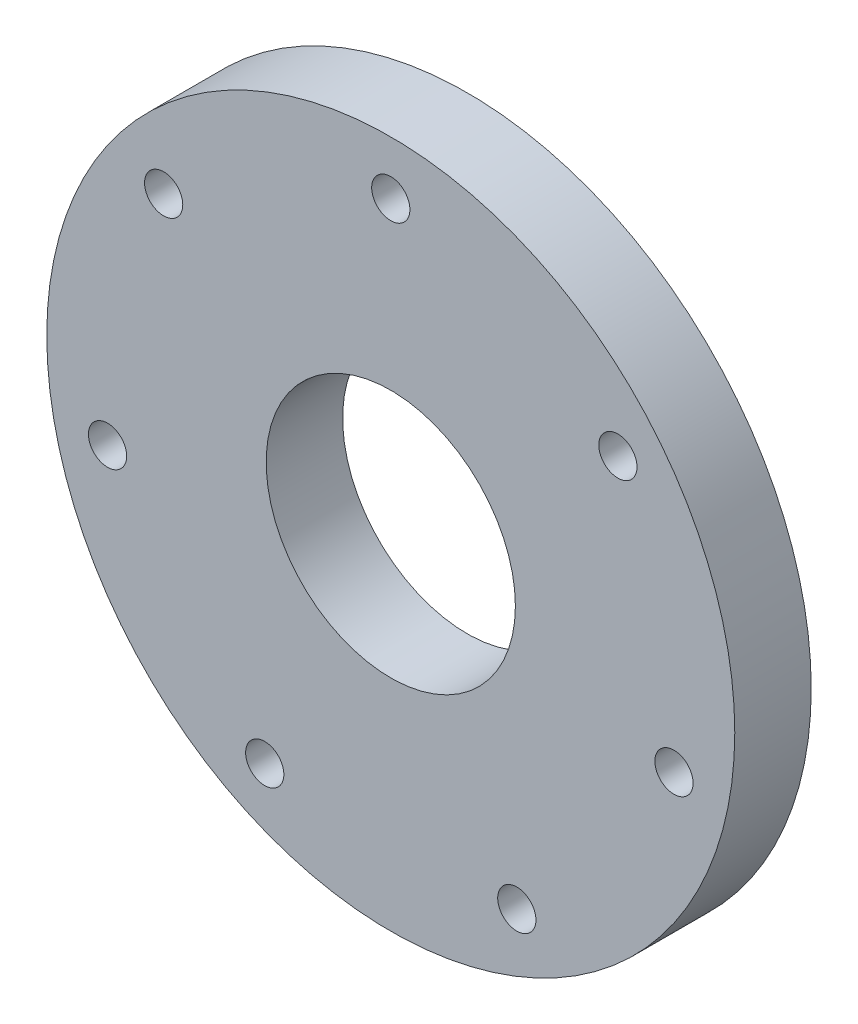
ISO-10303-21;
HEADER;
FILE_DESCRIPTION(('STEP AP214'),'2;1');
FILE_NAME('part.step','',(''),(''),'','','');
FILE_SCHEMA(('AUTOMOTIVE_DESIGN { 1 0 10303 214 1 1 1 1 }'));
ENDSEC;
DATA;
#1=APPLICATION_CONTEXT('core data for automotive mechanical design processes');
#2=APPLICATION_PROTOCOL_DEFINITION('international standard','automotive_design',2000,#1);
#3=PRODUCT_CONTEXT('',#1,'mechanical');
#4=PRODUCT('Part','Part','',(#3));
#5=PRODUCT_RELATED_PRODUCT_CATEGORY('part','',(#4));
#6=PRODUCT_DEFINITION_FORMATION('','',#4);
#7=PRODUCT_DEFINITION_CONTEXT('part definition',#1,'design');
#8=PRODUCT_DEFINITION('design','',#6,#7);
#9=PRODUCT_DEFINITION_SHAPE('','',#8);
#10=(LENGTH_UNIT() NAMED_UNIT(*) SI_UNIT(.MILLI.,.METRE.));
#11=(NAMED_UNIT(*) PLANE_ANGLE_UNIT() SI_UNIT($,.RADIAN.));
#12=(NAMED_UNIT(*) SI_UNIT($,.STERADIAN.) SOLID_ANGLE_UNIT());
#13=UNCERTAINTY_MEASURE_WITH_UNIT(LENGTH_MEASURE(1.E-05),#10,'distance_accuracy_value','');
#14=(GEOMETRIC_REPRESENTATION_CONTEXT(3) GLOBAL_UNCERTAINTY_ASSIGNED_CONTEXT((#13)) GLOBAL_UNIT_ASSIGNED_CONTEXT((#10,
#11,#12)) REPRESENTATION_CONTEXT('',''));
#15=CARTESIAN_POINT('',(0.,0.,0.));
#16=DIRECTION('',(0.,0.,1.));
#17=DIRECTION('',(1.,0.,0.));
#18=AXIS2_PLACEMENT_3D('',#15,#16,#17);
#19=CARTESIAN_POINT('',(0.,0.,5.));
#20=DIRECTION('',(0.,0.,1.));
#21=DIRECTION('',(1.,0.,0.));
#22=AXIS2_PLACEMENT_3D('',#19,#20,#21);
#23=PLANE('',#22);
#24=CARTESIAN_POINT('',(-8.24379104323223,-17.1184084901463,5.));
#25=DIRECTION('',(0.,0.,1.));
#26=DIRECTION('',(1.,0.,0.));
#27=AXIS2_PLACEMENT_3D('',#24,#25,#26);
#28=CIRCLE('',#27,1.25000000000021);
#29=CARTESIAN_POINT('',(-6.99379104323203,-17.1184084901463,5.));
#30=VERTEX_POINT('',#29);
#31=EDGE_CURVE('E77',#30,#30,#28,.T.);
#32=ORIENTED_EDGE('',*,*,#31,.F.);
#33=EDGE_LOOP('',(#32));
#34=FACE_BOUND('',#33,.T.);
#35=CARTESIAN_POINT('',(18.5236303314554,-4.22789774516939,5.));
#36=DIRECTION('',(0.,0.,1.));
#37=DIRECTION('',(1.,0.,0.));
#38=AXIS2_PLACEMENT_3D('',#35,#36,#37);
#39=CIRCLE('',#38,1.25);
#40=CARTESIAN_POINT('',(19.7736303314554,-4.22789774516939,5.));
#41=VERTEX_POINT('',#40);
#42=EDGE_CURVE('E65',#41,#41,#39,.T.);
#43=ORIENTED_EDGE('',*,*,#42,.F.);
#44=EDGE_LOOP('',(#43));
#45=FACE_BOUND('',#44,.T.);
#46=CARTESIAN_POINT('',(-14.8547981668923,11.8463062353154,5.));
#47=DIRECTION('',(0.,0.,1.));
#48=DIRECTION('',(1.,0.,0.));
#49=AXIS2_PLACEMENT_3D('',#46,#47,#48);
#50=CIRCLE('',#49,1.25000000000064);
#51=CARTESIAN_POINT('',(-13.6047981668917,11.8463062353154,5.));
#52=VERTEX_POINT('',#51);
#53=EDGE_CURVE('E53',#52,#52,#50,.T.);
#54=ORIENTED_EDGE('',*,*,#53,.F.);
#55=EDGE_LOOP('',(#54));
#56=FACE_BOUND('',#55,.T.);
#57=CARTESIAN_POINT('',(0.,19.,5.));
#58=DIRECTION('',(0.,0.,1.));
#59=DIRECTION('',(1.,0.,0.));
#60=AXIS2_PLACEMENT_3D('',#57,#58,#59);
#61=CIRCLE('',#60,1.25);
#62=CARTESIAN_POINT('',(1.25,19.,5.));
#63=VERTEX_POINT('',#62);
#64=EDGE_CURVE('E42',#63,#63,#61,.T.);
#65=ORIENTED_EDGE('',*,*,#64,.F.);
#66=EDGE_LOOP('',(#65));
#67=FACE_BOUND('',#66,.T.);
#68=CARTESIAN_POINT('',(0.,0.,5.));
#69=DIRECTION('',(0.,0.,1.));
#70=DIRECTION('',(1.,0.,0.));
#71=AXIS2_PLACEMENT_3D('',#68,#69,#70);
#72=CIRCLE('',#71,22.5);
#73=CARTESIAN_POINT('',(22.5,0.,5.));
#74=VERTEX_POINT('',#73);
#75=EDGE_CURVE('E10',#74,#74,#72,.T.);
#76=ORIENTED_EDGE('',*,*,#75,.T.);
#77=EDGE_LOOP('',(#76));
#78=FACE_BOUND('',#77,.T.);
#79=CARTESIAN_POINT('',(0.,0.,5.));
#80=DIRECTION('',(0.,0.,1.));
#81=DIRECTION('',(1.,0.,0.));
#82=AXIS2_PLACEMENT_3D('',#79,#80,#81);
#83=CIRCLE('',#82,8.15);
#84=CARTESIAN_POINT('',(8.15,0.,5.));
#85=VERTEX_POINT('',#84);
#86=EDGE_CURVE('E47',#85,#85,#83,.T.);
#87=ORIENTED_EDGE('',*,*,#86,.F.);
#88=EDGE_LOOP('',(#87));
#89=FACE_BOUND('',#88,.T.);
#90=CARTESIAN_POINT('',(14.854798166893,11.8463062353164,5.));
#91=DIRECTION('',(0.,0.,1.));
#92=DIRECTION('',(1.,0.,0.));
#93=AXIS2_PLACEMENT_3D('',#90,#91,#92);
#94=CIRCLE('',#93,1.25);
#95=CARTESIAN_POINT('',(16.104798166893,11.8463062353164,5.));
#96=VERTEX_POINT('',#95);
#97=EDGE_CURVE('E59',#96,#96,#94,.T.);
#98=ORIENTED_EDGE('',*,*,#97,.F.);
#99=EDGE_LOOP('',(#98));
#100=FACE_BOUND('',#99,.T.);
#101=CARTESIAN_POINT('',(8.24379104323457,-17.1184084901455,5.));
#102=DIRECTION('',(0.,0.,1.));
#103=DIRECTION('',(1.,0.,0.));
#104=AXIS2_PLACEMENT_3D('',#101,#102,#103);
#105=CIRCLE('',#104,1.25);
#106=CARTESIAN_POINT('',(9.49379104323457,-17.1184084901455,5.));
#107=VERTEX_POINT('',#106);
#108=EDGE_CURVE('E71',#107,#107,#105,.T.);
#109=ORIENTED_EDGE('',*,*,#108,.F.);
#110=EDGE_LOOP('',(#109));
#111=FACE_BOUND('',#110,.T.);
#112=CARTESIAN_POINT('',(-18.5236303314538,-4.22789774517068,5.));
#113=DIRECTION('',(0.,0.,1.));
#114=DIRECTION('',(1.,0.,0.));
#115=AXIS2_PLACEMENT_3D('',#112,#113,#114);
#116=CIRCLE('',#115,1.25000000000046);
#117=CARTESIAN_POINT('',(-17.2736303314533,-4.22789774517068,5.));
#118=VERTEX_POINT('',#117);
#119=EDGE_CURVE('E83',#118,#118,#116,.T.);
#120=ORIENTED_EDGE('',*,*,#119,.F.);
#121=EDGE_LOOP('',(#120));
#122=FACE_BOUND('',#121,.T.);
#123=ADVANCED_FACE('F31',(#34,#45,#56,#67,#78,#89,#100,#111,#122),#23,.T.);
#124=CARTESIAN_POINT('',(0.,0.,0.));
#125=DIRECTION('',(0.,0.,1.));
#126=DIRECTION('',(1.,0.,0.));
#127=AXIS2_PLACEMENT_3D('',#124,#125,#126);
#128=PLANE('',#127);
#129=CARTESIAN_POINT('',(0.,0.,0.));
#130=DIRECTION('',(0.,0.,1.));
#131=DIRECTION('',(1.,0.,0.));
#132=AXIS2_PLACEMENT_3D('',#129,#130,#131);
#133=CIRCLE('',#132,22.5);
#134=CARTESIAN_POINT('',(22.5,0.,0.));
#135=VERTEX_POINT('',#134);
#136=EDGE_CURVE('E35',#135,#135,#133,.T.);
#137=ORIENTED_EDGE('',*,*,#136,.F.);
#138=EDGE_LOOP('',(#137));
#139=FACE_BOUND('',#138,.T.);
#140=CARTESIAN_POINT('',(0.,19.,0.));
#141=DIRECTION('',(0.,0.,1.));
#142=DIRECTION('',(1.,0.,0.));
#143=AXIS2_PLACEMENT_3D('',#140,#141,#142);
#144=CIRCLE('',#143,1.25);
#145=CARTESIAN_POINT('',(1.25,19.,0.));
#146=VERTEX_POINT('',#145);
#147=EDGE_CURVE('E44',#146,#146,#144,.T.);
#148=ORIENTED_EDGE('',*,*,#147,.T.);
#149=EDGE_LOOP('',(#148));
#150=FACE_BOUND('',#149,.T.);
#151=CARTESIAN_POINT('',(0.,0.,0.));
#152=DIRECTION('',(0.,0.,1.));
#153=DIRECTION('',(1.,0.,0.));
#154=AXIS2_PLACEMENT_3D('',#151,#152,#153);
#155=CIRCLE('',#154,8.15);
#156=CARTESIAN_POINT('',(8.15,0.,0.));
#157=VERTEX_POINT('',#156);
#158=EDGE_CURVE('E50',#157,#157,#155,.T.);
#159=ORIENTED_EDGE('',*,*,#158,.T.);
#160=EDGE_LOOP('',(#159));
#161=FACE_BOUND('',#160,.T.);
#162=CARTESIAN_POINT('',(-14.8547981668923,11.8463062353154,0.));
#163=DIRECTION('',(0.,0.,1.));
#164=DIRECTION('',(1.,0.,0.));
#165=AXIS2_PLACEMENT_3D('',#162,#163,#164);
#166=CIRCLE('',#165,1.25000000000064);
#167=CARTESIAN_POINT('',(-13.6047981668917,11.8463062353154,0.));
#168=VERTEX_POINT('',#167);
#169=EDGE_CURVE('E56',#168,#168,#166,.T.);
#170=ORIENTED_EDGE('',*,*,#169,.T.);
#171=EDGE_LOOP('',(#170));
#172=FACE_BOUND('',#171,.T.);
#173=CARTESIAN_POINT('',(14.854798166893,11.8463062353164,0.));
#174=DIRECTION('',(0.,0.,1.));
#175=DIRECTION('',(1.,0.,0.));
#176=AXIS2_PLACEMENT_3D('',#173,#174,#175);
#177=CIRCLE('',#176,1.25);
#178=CARTESIAN_POINT('',(16.104798166893,11.8463062353164,0.));
#179=VERTEX_POINT('',#178);
#180=EDGE_CURVE('E62',#179,#179,#177,.T.);
#181=ORIENTED_EDGE('',*,*,#180,.T.);
#182=EDGE_LOOP('',(#181));
#183=FACE_BOUND('',#182,.T.);
#184=CARTESIAN_POINT('',(18.5236303314554,-4.22789774516939,0.));
#185=DIRECTION('',(0.,0.,1.));
#186=DIRECTION('',(1.,0.,0.));
#187=AXIS2_PLACEMENT_3D('',#184,#185,#186);
#188=CIRCLE('',#187,1.25);
#189=CARTESIAN_POINT('',(19.7736303314554,-4.22789774516939,0.));
#190=VERTEX_POINT('',#189);
#191=EDGE_CURVE('E68',#190,#190,#188,.T.);
#192=ORIENTED_EDGE('',*,*,#191,.T.);
#193=EDGE_LOOP('',(#192));
#194=FACE_BOUND('',#193,.T.);
#195=CARTESIAN_POINT('',(8.24379104323457,-17.1184084901455,0.));
#196=DIRECTION('',(0.,0.,1.));
#197=DIRECTION('',(1.,0.,0.));
#198=AXIS2_PLACEMENT_3D('',#195,#196,#197);
#199=CIRCLE('',#198,1.25);
#200=CARTESIAN_POINT('',(9.49379104323457,-17.1184084901455,0.));
#201=VERTEX_POINT('',#200);
#202=EDGE_CURVE('E74',#201,#201,#199,.T.);
#203=ORIENTED_EDGE('',*,*,#202,.T.);
#204=EDGE_LOOP('',(#203));
#205=FACE_BOUND('',#204,.T.);
#206=CARTESIAN_POINT('',(-8.24379104323223,-17.1184084901463,0.));
#207=DIRECTION('',(0.,0.,1.));
#208=DIRECTION('',(1.,0.,0.));
#209=AXIS2_PLACEMENT_3D('',#206,#207,#208);
#210=CIRCLE('',#209,1.25000000000021);
#211=CARTESIAN_POINT('',(-6.99379104323203,-17.1184084901463,0.));
#212=VERTEX_POINT('',#211);
#213=EDGE_CURVE('E80',#212,#212,#210,.T.);
#214=ORIENTED_EDGE('',*,*,#213,.T.);
#215=EDGE_LOOP('',(#214));
#216=FACE_BOUND('',#215,.T.);
#217=CARTESIAN_POINT('',(-18.5236303314538,-4.22789774517068,0.));
#218=DIRECTION('',(0.,0.,1.));
#219=DIRECTION('',(1.,0.,0.));
#220=AXIS2_PLACEMENT_3D('',#217,#218,#219);
#221=CIRCLE('',#220,1.25000000000046);
#222=CARTESIAN_POINT('',(-17.2736303314533,-4.22789774517068,0.));
#223=VERTEX_POINT('',#222);
#224=EDGE_CURVE('E86',#223,#223,#221,.T.);
#225=ORIENTED_EDGE('',*,*,#224,.T.);
#226=EDGE_LOOP('',(#225));
#227=FACE_BOUND('',#226,.T.);
#228=ADVANCED_FACE('F96',(#139,#150,#161,#172,#183,#194,#205,#216,#227),#128,.F.);
#229=CARTESIAN_POINT('',(0.,0.,5.));
#230=DIRECTION('',(0.,0.,-1.));
#231=DIRECTION('',(-1.,0.,0.));
#232=AXIS2_PLACEMENT_3D('',#229,#230,#231);
#233=CYLINDRICAL_SURFACE('',#232,22.5);
#234=ORIENTED_EDGE('',*,*,#75,.F.);
#235=EDGE_LOOP('',(#234));
#236=FACE_BOUND('',#235,.T.);
#237=ORIENTED_EDGE('',*,*,#136,.T.);
#238=EDGE_LOOP('',(#237));
#239=FACE_BOUND('',#238,.T.);
#240=ADVANCED_FACE('F33',(#236,#239),#233,.T.);
#241=CARTESIAN_POINT('',(0.,19.,5.));
#242=DIRECTION('',(0.,0.,-1.));
#243=DIRECTION('',(-1.,0.,0.));
#244=AXIS2_PLACEMENT_3D('',#241,#242,#243);
#245=CYLINDRICAL_SURFACE('',#244,1.25);
#246=ORIENTED_EDGE('',*,*,#64,.T.);
#247=EDGE_LOOP('',(#246));
#248=FACE_BOUND('',#247,.T.);
#249=ORIENTED_EDGE('',*,*,#147,.F.);
#250=EDGE_LOOP('',(#249));
#251=FACE_BOUND('',#250,.T.);
#252=ADVANCED_FACE('F106',(#248,#251),#245,.F.);
#253=CARTESIAN_POINT('',(0.,0.,5.));
#254=DIRECTION('',(0.,0.,-1.));
#255=DIRECTION('',(-1.,0.,0.));
#256=AXIS2_PLACEMENT_3D('',#253,#254,#255);
#257=CYLINDRICAL_SURFACE('',#256,8.15);
#258=ORIENTED_EDGE('',*,*,#86,.T.);
#259=EDGE_LOOP('',(#258));
#260=FACE_BOUND('',#259,.T.);
#261=ORIENTED_EDGE('',*,*,#158,.F.);
#262=EDGE_LOOP('',(#261));
#263=FACE_BOUND('',#262,.T.);
#264=ADVANCED_FACE('F109',(#260,#263),#257,.F.);
#265=CARTESIAN_POINT('',(-14.8547981668923,11.8463062353154,5.));
#266=DIRECTION('',(0.,0.,-1.));
#267=DIRECTION('',(-1.,0.,0.));
#268=AXIS2_PLACEMENT_3D('',#265,#266,#267);
#269=CYLINDRICAL_SURFACE('',#268,1.25000000000064);
#270=ORIENTED_EDGE('',*,*,#53,.T.);
#271=EDGE_LOOP('',(#270));
#272=FACE_BOUND('',#271,.T.);
#273=ORIENTED_EDGE('',*,*,#169,.F.);
#274=EDGE_LOOP('',(#273));
#275=FACE_BOUND('',#274,.T.);
#276=ADVANCED_FACE('F113',(#272,#275),#269,.F.);
#277=CARTESIAN_POINT('',(14.854798166893,11.8463062353164,5.));
#278=DIRECTION('',(0.,0.,-1.));
#279=DIRECTION('',(-1.,0.,0.));
#280=AXIS2_PLACEMENT_3D('',#277,#278,#279);
#281=CYLINDRICAL_SURFACE('',#280,1.25);
#282=ORIENTED_EDGE('',*,*,#97,.T.);
#283=EDGE_LOOP('',(#282));
#284=FACE_BOUND('',#283,.T.);
#285=ORIENTED_EDGE('',*,*,#180,.F.);
#286=EDGE_LOOP('',(#285));
#287=FACE_BOUND('',#286,.T.);
#288=ADVANCED_FACE('F117',(#284,#287),#281,.F.);
#289=CARTESIAN_POINT('',(18.5236303314554,-4.22789774516939,5.));
#290=DIRECTION('',(0.,0.,-1.));
#291=DIRECTION('',(-1.,0.,0.));
#292=AXIS2_PLACEMENT_3D('',#289,#290,#291);
#293=CYLINDRICAL_SURFACE('',#292,1.25);
#294=ORIENTED_EDGE('',*,*,#42,.T.);
#295=EDGE_LOOP('',(#294));
#296=FACE_BOUND('',#295,.T.);
#297=ORIENTED_EDGE('',*,*,#191,.F.);
#298=EDGE_LOOP('',(#297));
#299=FACE_BOUND('',#298,.T.);
#300=ADVANCED_FACE('F121',(#296,#299),#293,.F.);
#301=CARTESIAN_POINT('',(8.24379104323457,-17.1184084901455,5.));
#302=DIRECTION('',(0.,0.,-1.));
#303=DIRECTION('',(-1.,0.,0.));
#304=AXIS2_PLACEMENT_3D('',#301,#302,#303);
#305=CYLINDRICAL_SURFACE('',#304,1.25);
#306=ORIENTED_EDGE('',*,*,#108,.T.);
#307=EDGE_LOOP('',(#306));
#308=FACE_BOUND('',#307,.T.);
#309=ORIENTED_EDGE('',*,*,#202,.F.);
#310=EDGE_LOOP('',(#309));
#311=FACE_BOUND('',#310,.T.);
#312=ADVANCED_FACE('F125',(#308,#311),#305,.F.);
#313=CARTESIAN_POINT('',(-8.24379104323223,-17.1184084901463,5.));
#314=DIRECTION('',(0.,0.,-1.));
#315=DIRECTION('',(-1.,0.,0.));
#316=AXIS2_PLACEMENT_3D('',#313,#314,#315);
#317=CYLINDRICAL_SURFACE('',#316,1.25000000000021);
#318=ORIENTED_EDGE('',*,*,#31,.T.);
#319=EDGE_LOOP('',(#318));
#320=FACE_BOUND('',#319,.T.);
#321=ORIENTED_EDGE('',*,*,#213,.F.);
#322=EDGE_LOOP('',(#321));
#323=FACE_BOUND('',#322,.T.);
#324=ADVANCED_FACE('F129',(#320,#323),#317,.F.);
#325=CARTESIAN_POINT('',(-18.5236303314538,-4.22789774517068,5.));
#326=DIRECTION('',(0.,0.,-1.));
#327=DIRECTION('',(-1.,0.,0.));
#328=AXIS2_PLACEMENT_3D('',#325,#326,#327);
#329=CYLINDRICAL_SURFACE('',#328,1.25000000000046);
#330=ORIENTED_EDGE('',*,*,#119,.T.);
#331=EDGE_LOOP('',(#330));
#332=FACE_BOUND('',#331,.T.);
#333=ORIENTED_EDGE('',*,*,#224,.F.);
#334=EDGE_LOOP('',(#333));
#335=FACE_BOUND('',#334,.T.);
#336=ADVANCED_FACE('F92',(#332,#335),#329,.F.);
#337=CLOSED_SHELL('',(#123,#228,#240,#252,#264,#276,#288,#300,#312,#324,#336));
#338=MANIFOLD_SOLID_BREP('B2',#337);
#339=ADVANCED_BREP_SHAPE_REPRESENTATION('',(#18,#338),#14);
#340=SHAPE_DEFINITION_REPRESENTATION(#9,#339);
ENDSEC;
END-ISO-10303-21;
